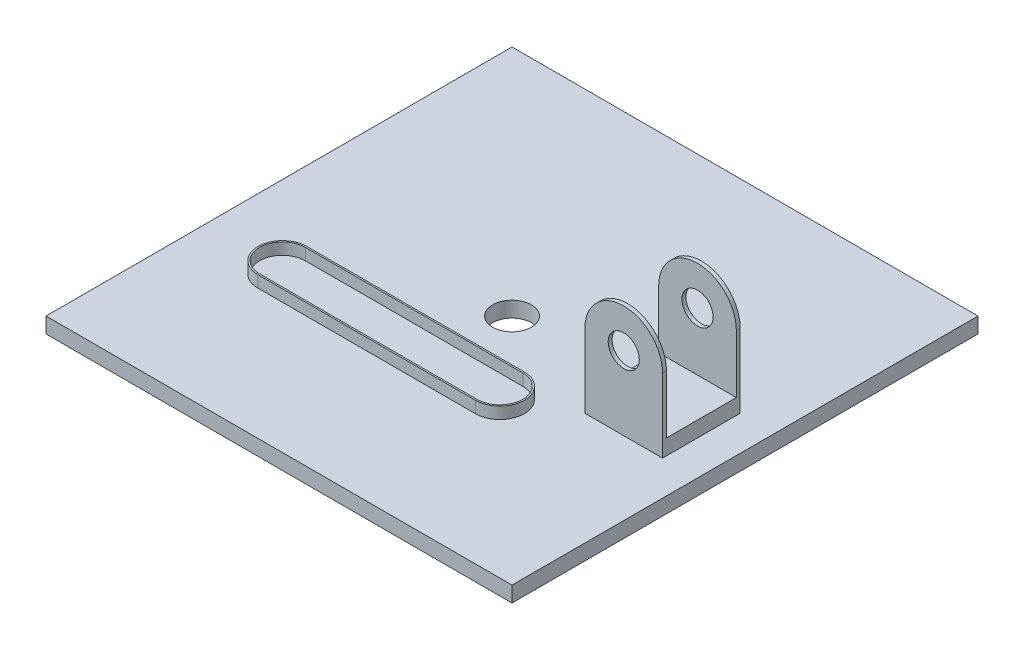
ISO-10303-21;
HEADER;
FILE_DESCRIPTION(('STEP AP214'),'2;1');
FILE_NAME('part.step','',(''),(''),'','','');
FILE_SCHEMA(('AUTOMOTIVE_DESIGN { 1 0 10303 214 1 1 1 1 }'));
ENDSEC;
DATA;
#1=APPLICATION_CONTEXT('core data for automotive mechanical design processes');
#2=APPLICATION_PROTOCOL_DEFINITION('international standard','automotive_design',2000,#1);
#3=PRODUCT_CONTEXT('',#1,'mechanical');
#4=PRODUCT('Part','Part','',(#3));
#5=PRODUCT_RELATED_PRODUCT_CATEGORY('part','',(#4));
#6=PRODUCT_DEFINITION_FORMATION('','',#4);
#7=PRODUCT_DEFINITION_CONTEXT('part definition',#1,'design');
#8=PRODUCT_DEFINITION('design','',#6,#7);
#9=PRODUCT_DEFINITION_SHAPE('','',#8);
#10=(LENGTH_UNIT() NAMED_UNIT(*) SI_UNIT(.MILLI.,.METRE.));
#11=(NAMED_UNIT(*) PLANE_ANGLE_UNIT() SI_UNIT($,.RADIAN.));
#12=(NAMED_UNIT(*) SI_UNIT($,.STERADIAN.) SOLID_ANGLE_UNIT());
#13=UNCERTAINTY_MEASURE_WITH_UNIT(LENGTH_MEASURE(1.E-05),#10,'distance_accuracy_value','');
#14=(GEOMETRIC_REPRESENTATION_CONTEXT(3) GLOBAL_UNCERTAINTY_ASSIGNED_CONTEXT((#13)) GLOBAL_UNIT_ASSIGNED_CONTEXT((#10,
#11,#12)) REPRESENTATION_CONTEXT('',''));
#15=CARTESIAN_POINT('',(0.,0.,0.));
#16=DIRECTION('',(0.,0.,1.));
#17=DIRECTION('',(1.,0.,0.));
#18=AXIS2_PLACEMENT_3D('',#15,#16,#17);
#19=CARTESIAN_POINT('',(0.,40.,0.));
#20=DIRECTION('',(0.,-1.,0.));
#21=DIRECTION('',(0.,0.,-1.));
#22=AXIS2_PLACEMENT_3D('',#19,#20,#21);
#23=PLANE('',#22);
#24=DIRECTION('',(1.,0.,0.));
#25=VECTOR('',#24,1.);
#26=CARTESIAN_POINT('',(0.,40.,-33.5314516707189));
#27=LINE('',#26,#25);
#28=CARTESIAN_POINT('',(155.348971612439,40.,-33.5314516707189));
#29=VERTEX_POINT('',#28);
#30=CARTESIAN_POINT('',(255.348971612439,40.,-33.5314516707189));
#31=VERTEX_POINT('',#30);
#32=EDGE_CURVE('E283',#29,#31,#27,.T.);
#33=ORIENTED_EDGE('',*,*,#32,.F.);
#34=DIRECTION('',(0.,0.,1.));
#35=VECTOR('',#34,1.);
#36=CARTESIAN_POINT('',(155.348971612439,40.,61.4685483292811));
#37=LINE('',#36,#35);
#38=CARTESIAN_POINT('',(155.348971612439,40.,56.4685483292811));
#39=VERTEX_POINT('',#38);
#40=EDGE_CURVE('E329',#29,#39,#37,.T.);
#41=ORIENTED_EDGE('',*,*,#40,.T.);
#42=DIRECTION('',(-1.,0.,0.));
#43=VECTOR('',#42,1.);
#44=CARTESIAN_POINT('',(0.,40.,56.4685483292811));
#45=LINE('',#44,#43);
#46=CARTESIAN_POINT('',(255.348971612439,40.,56.4685483292811));
#47=VERTEX_POINT('',#46);
#48=EDGE_CURVE('E310',#47,#39,#45,.T.);
#49=ORIENTED_EDGE('',*,*,#48,.F.);
#50=DIRECTION('',(0.,0.,-1.));
#51=VECTOR('',#50,1.);
#52=CARTESIAN_POINT('',(255.348971612439,40.,61.4685483292811));
#53=LINE('',#52,#51);
#54=EDGE_CURVE('E327',#47,#31,#53,.T.);
#55=ORIENTED_EDGE('',*,*,#54,.T.);
#56=EDGE_LOOP('',(#33,#41,#49,#55));
#57=FACE_BOUND('',#56,.T.);
#58=ADVANCED_FACE('F65',(#57),#23,.F.);
#59=CARTESIAN_POINT('',(0.,20.,0.));
#60=DIRECTION('',(0.,-1.,0.));
#61=DIRECTION('',(0.,0.,-1.));
#62=AXIS2_PLACEMENT_3D('',#59,#60,#61);
#63=PLANE('',#62);
#64=CARTESIAN_POINT('',(0.,20.,0.));
#65=DIRECTION('',(0.,1.,0.));
#66=DIRECTION('',(0.,0.,1.));
#67=AXIS2_PLACEMENT_3D('',#64,#65,#66);
#68=CIRCLE('',#67,25.);
#69=CARTESIAN_POINT('',(0.,20.,25.));
#70=VERTEX_POINT('',#69);
#71=EDGE_CURVE('E683',#70,#70,#68,.T.);
#72=ORIENTED_EDGE('',*,*,#71,.F.);
#73=EDGE_LOOP('',(#72));
#74=FACE_BOUND('',#73,.T.);
#75=DIRECTION('',(-1.,0.,0.));
#76=VECTOR('',#75,1.);
#77=CARTESIAN_POINT('',(0.,20.,69.4685483292811));
#78=LINE('',#77,#76);
#79=CARTESIAN_POINT('',(85.3547783407376,20.,69.4685483292811));
#80=VERTEX_POINT('',#79);
#81=CARTESIAN_POINT('',(-194.645221659262,20.,69.4685483292812));
#82=VERTEX_POINT('',#81);
#83=EDGE_CURVE('E220',#80,#82,#78,.T.);
#84=ORIENTED_EDGE('',*,*,#83,.F.);
#85=CARTESIAN_POINT('',(85.3547783407376,20.,100.968548329281));
#86=DIRECTION('',(0.,1.,0.));
#87=DIRECTION('',(1.,0.,0.));
#88=AXIS2_PLACEMENT_3D('',#85,#86,#87);
#89=CIRCLE('',#88,31.5);
#90=CARTESIAN_POINT('',(85.3547783407376,20.,132.468548329281));
#91=VERTEX_POINT('',#90);
#92=EDGE_CURVE('E249',#91,#80,#89,.T.);
#93=ORIENTED_EDGE('',*,*,#92,.F.);
#94=DIRECTION('',(-1.,0.,0.));
#95=VECTOR('',#94,1.);
#96=CARTESIAN_POINT('',(0.,20.,132.468548329281));
#97=LINE('',#96,#95);
#98=CARTESIAN_POINT('',(-194.645221659262,20.,132.468548329281));
#99=VERTEX_POINT('',#98);
#100=EDGE_CURVE('E85',#91,#99,#97,.T.);
#101=ORIENTED_EDGE('',*,*,#100,.T.);
#102=CARTESIAN_POINT('',(-194.645221659262,20.,100.968548329281));
#103=DIRECTION('',(0.,1.,0.));
#104=DIRECTION('',(1.,0.,0.));
#105=AXIS2_PLACEMENT_3D('',#102,#103,#104);
#106=CIRCLE('',#105,31.5);
#107=EDGE_CURVE('E80',#82,#99,#106,.T.);
#108=ORIENTED_EDGE('',*,*,#107,.F.);
#109=EDGE_LOOP('',(#84,#93,#101,#108));
#110=FACE_BOUND('',#109,.T.);
#111=DIRECTION('',(0.,0.,-1.));
#112=VECTOR('',#111,1.);
#113=CARTESIAN_POINT('',(300.,20.,300.));
#114=LINE('',#113,#112);
#115=CARTESIAN_POINT('',(300.,20.,300.));
#116=VERTEX_POINT('',#115);
#117=CARTESIAN_POINT('',(300.,20.,-300.));
#118=VERTEX_POINT('',#117);
#119=EDGE_CURVE('E355',#116,#118,#114,.T.);
#120=ORIENTED_EDGE('',*,*,#119,.T.);
#121=DIRECTION('',(-1.,0.,0.));
#122=VECTOR('',#121,1.);
#123=CARTESIAN_POINT('',(-300.,20.,-300.));
#124=LINE('',#123,#122);
#125=CARTESIAN_POINT('',(-300.,20.,-300.));
#126=VERTEX_POINT('',#125);
#127=EDGE_CURVE('E358',#118,#126,#124,.T.);
#128=ORIENTED_EDGE('',*,*,#127,.T.);
#129=DIRECTION('',(0.,0.,1.));
#130=VECTOR('',#129,1.);
#131=CARTESIAN_POINT('',(-300.,20.,300.));
#132=LINE('',#131,#130);
#133=CARTESIAN_POINT('',(-300.,20.,300.));
#134=VERTEX_POINT('',#133);
#135=EDGE_CURVE('E361',#126,#134,#132,.T.);
#136=ORIENTED_EDGE('',*,*,#135,.T.);
#137=DIRECTION('',(1.,0.,0.));
#138=VECTOR('',#137,1.);
#139=CARTESIAN_POINT('',(-300.,20.,300.));
#140=LINE('',#139,#138);
#141=EDGE_CURVE('E363',#134,#116,#140,.T.);
#142=ORIENTED_EDGE('',*,*,#141,.T.);
#143=EDGE_LOOP('',(#120,#128,#136,#142));
#144=FACE_BOUND('',#143,.T.);
#145=DIRECTION('',(0.,0.,-1.));
#146=VECTOR('',#145,1.);
#147=CARTESIAN_POINT('',(255.348971612439,20.,61.4685483292811));
#148=LINE('',#147,#146);
#149=CARTESIAN_POINT('',(255.348971612439,20.,61.4685483292811));
#150=VERTEX_POINT('',#149);
#151=CARTESIAN_POINT('',(255.348971612439,20.,-38.5314516707189));
#152=VERTEX_POINT('',#151);
#153=EDGE_CURVE('E324',#150,#152,#148,.T.);
#154=ORIENTED_EDGE('',*,*,#153,.F.);
#155=DIRECTION('',(1.,0.,0.));
#156=VECTOR('',#155,1.);
#157=CARTESIAN_POINT('',(155.348971612439,20.,61.4685483292811));
#158=LINE('',#157,#156);
#159=CARTESIAN_POINT('',(155.348971612439,20.,61.4685483292811));
#160=VERTEX_POINT('',#159);
#161=EDGE_CURVE('E330',#160,#150,#158,.T.);
#162=ORIENTED_EDGE('',*,*,#161,.F.);
#163=DIRECTION('',(0.,0.,1.));
#164=VECTOR('',#163,1.);
#165=CARTESIAN_POINT('',(155.348971612439,20.,61.4685483292811));
#166=LINE('',#165,#164);
#167=CARTESIAN_POINT('',(155.348971612439,20.,-38.5314516707189));
#168=VERTEX_POINT('',#167);
#169=EDGE_CURVE('E338',#168,#160,#166,.T.);
#170=ORIENTED_EDGE('',*,*,#169,.F.);
#171=DIRECTION('',(-1.,0.,0.));
#172=VECTOR('',#171,1.);
#173=CARTESIAN_POINT('',(155.348971612439,20.,-38.5314516707189));
#174=LINE('',#173,#172);
#175=EDGE_CURVE('E335',#152,#168,#174,.T.);
#176=ORIENTED_EDGE('',*,*,#175,.F.);
#177=EDGE_LOOP('',(#154,#162,#170,#176));
#178=FACE_BOUND('',#177,.T.);
#179=ADVANCED_FACE('F397',(#74,#110,#144,#178),#63,.F.);
#180=CARTESIAN_POINT('',(300.,20.,300.));
#181=DIRECTION('',(-1.,0.,0.));
#182=DIRECTION('',(0.,0.,1.));
#183=AXIS2_PLACEMENT_3D('',#180,#181,#182);
#184=PLANE('',#183);
#185=DIRECTION('',(0.,0.,-1.));
#186=VECTOR('',#185,1.);
#187=CARTESIAN_POINT('',(300.,0.,300.));
#188=LINE('',#187,#186);
#189=CARTESIAN_POINT('',(300.,0.,300.));
#190=VERTEX_POINT('',#189);
#191=CARTESIAN_POINT('',(300.,0.,-300.));
#192=VERTEX_POINT('',#191);
#193=EDGE_CURVE('E354',#190,#192,#188,.T.);
#194=ORIENTED_EDGE('',*,*,#193,.T.);
#195=DIRECTION('',(0.,-1.,0.));
#196=VECTOR('',#195,1.);
#197=CARTESIAN_POINT('',(300.,20.,-300.));
#198=LINE('',#197,#196);
#199=EDGE_CURVE('E12',#118,#192,#198,.T.);
#200=ORIENTED_EDGE('',*,*,#199,.F.);
#201=ORIENTED_EDGE('',*,*,#119,.F.);
#202=DIRECTION('',(0.,-1.,0.));
#203=VECTOR('',#202,1.);
#204=CARTESIAN_POINT('',(300.,20.,300.));
#205=LINE('',#204,#203);
#206=EDGE_CURVE('E365',#116,#190,#205,.T.);
#207=ORIENTED_EDGE('',*,*,#206,.T.);
#208=EDGE_LOOP('',(#194,#200,#201,#207));
#209=FACE_BOUND('',#208,.T.);
#210=ADVANCED_FACE('F67',(#209),#184,.F.);
#211=CARTESIAN_POINT('',(-300.,20.,-300.));
#212=DIRECTION('',(0.,0.,1.));
#213=DIRECTION('',(1.,0.,0.));
#214=AXIS2_PLACEMENT_3D('',#211,#212,#213);
#215=PLANE('',#214);
#216=DIRECTION('',(-1.,0.,0.));
#217=VECTOR('',#216,1.);
#218=CARTESIAN_POINT('',(-300.,0.,-300.));
#219=LINE('',#218,#217);
#220=CARTESIAN_POINT('',(-300.,0.,-300.));
#221=VERTEX_POINT('',#220);
#222=EDGE_CURVE('E368',#192,#221,#219,.T.);
#223=ORIENTED_EDGE('',*,*,#222,.T.);
#224=DIRECTION('',(0.,-1.,0.));
#225=VECTOR('',#224,1.);
#226=CARTESIAN_POINT('',(-300.,20.,-300.));
#227=LINE('',#226,#225);
#228=EDGE_CURVE('E73',#126,#221,#227,.T.);
#229=ORIENTED_EDGE('',*,*,#228,.F.);
#230=ORIENTED_EDGE('',*,*,#127,.F.);
#231=ORIENTED_EDGE('',*,*,#199,.T.);
#232=EDGE_LOOP('',(#223,#229,#230,#231));
#233=FACE_BOUND('',#232,.T.);
#234=ADVANCED_FACE('F399',(#233),#215,.F.);
#235=CARTESIAN_POINT('',(-300.,20.,300.));
#236=DIRECTION('',(1.,0.,0.));
#237=DIRECTION('',(0.,0.,-1.));
#238=AXIS2_PLACEMENT_3D('',#235,#236,#237);
#239=PLANE('',#238);
#240=DIRECTION('',(0.,0.,1.));
#241=VECTOR('',#240,1.);
#242=CARTESIAN_POINT('',(-300.,0.,300.));
#243=LINE('',#242,#241);
#244=CARTESIAN_POINT('',(-300.,0.,300.));
#245=VERTEX_POINT('',#244);
#246=EDGE_CURVE('E370',#221,#245,#243,.T.);
#247=ORIENTED_EDGE('',*,*,#246,.T.);
#248=DIRECTION('',(0.,-1.,0.));
#249=VECTOR('',#248,1.);
#250=CARTESIAN_POINT('',(-300.,20.,300.));
#251=LINE('',#250,#249);
#252=EDGE_CURVE('E375',#134,#245,#251,.T.);
#253=ORIENTED_EDGE('',*,*,#252,.F.);
#254=ORIENTED_EDGE('',*,*,#135,.F.);
#255=ORIENTED_EDGE('',*,*,#228,.T.);
#256=EDGE_LOOP('',(#247,#253,#254,#255));
#257=FACE_BOUND('',#256,.T.);
#258=ADVANCED_FACE('F382',(#257),#239,.F.);
#259=CARTESIAN_POINT('',(-300.,20.,300.));
#260=DIRECTION('',(0.,0.,-1.));
#261=DIRECTION('',(-1.,0.,0.));
#262=AXIS2_PLACEMENT_3D('',#259,#260,#261);
#263=PLANE('',#262);
#264=DIRECTION('',(1.,0.,0.));
#265=VECTOR('',#264,1.);
#266=CARTESIAN_POINT('',(-300.,0.,300.));
#267=LINE('',#266,#265);
#268=EDGE_CURVE('E359',#245,#190,#267,.T.);
#269=ORIENTED_EDGE('',*,*,#268,.T.);
#270=ORIENTED_EDGE('',*,*,#206,.F.);
#271=ORIENTED_EDGE('',*,*,#141,.F.);
#272=ORIENTED_EDGE('',*,*,#252,.T.);
#273=EDGE_LOOP('',(#269,#270,#271,#272));
#274=FACE_BOUND('',#273,.T.);
#275=ADVANCED_FACE('F391',(#274),#263,.F.);
#276=CARTESIAN_POINT('',(0.,0.,0.));
#277=DIRECTION('',(0.,-1.,0.));
#278=DIRECTION('',(0.,0.,-1.));
#279=AXIS2_PLACEMENT_3D('',#276,#277,#278);
#280=PLANE('',#279);
#281=CARTESIAN_POINT('',(0.,0.,0.));
#282=DIRECTION('',(0.,-1.,0.));
#283=DIRECTION('',(0.,0.,-1.));
#284=AXIS2_PLACEMENT_3D('',#281,#282,#283);
#285=CIRCLE('',#284,25.);
#286=CARTESIAN_POINT('',(0.,0.,-25.));
#287=VERTEX_POINT('',#286);
#288=EDGE_CURVE('E234',#287,#287,#285,.F.);
#289=ORIENTED_EDGE('',*,*,#288,.T.);
#290=EDGE_LOOP('',(#289));
#291=FACE_BOUND('',#290,.T.);
#292=ORIENTED_EDGE('',*,*,#193,.F.);
#293=ORIENTED_EDGE('',*,*,#268,.F.);
#294=ORIENTED_EDGE('',*,*,#246,.F.);
#295=ORIENTED_EDGE('',*,*,#222,.F.);
#296=EDGE_LOOP('',(#292,#293,#294,#295));
#297=FACE_BOUND('',#296,.T.);
#298=ADVANCED_FACE('F388',(#291,#297),#280,.T.);
#299=CARTESIAN_POINT('',(255.348971612439,40.,61.4685483292811));
#300=DIRECTION('',(-1.,0.,0.));
#301=DIRECTION('',(0.,0.,1.));
#302=AXIS2_PLACEMENT_3D('',#299,#300,#301);
#303=PLANE('',#302);
#304=ORIENTED_EDGE('',*,*,#153,.T.);
#305=DIRECTION('',(0.,-1.,0.));
#306=VECTOR('',#305,1.);
#307=CARTESIAN_POINT('',(255.348971612439,40.,-38.5314516707189));
#308=LINE('',#307,#306);
#309=CARTESIAN_POINT('',(255.348971612439,114.766543298254,-38.5314516707189));
#310=VERTEX_POINT('',#309);
#311=EDGE_CURVE('E351',#310,#152,#308,.T.);
#312=ORIENTED_EDGE('',*,*,#311,.F.);
#313=DIRECTION('',(0.,0.,-1.));
#314=VECTOR('',#313,1.);
#315=CARTESIAN_POINT('',(255.348971612439,114.766543298254,-33.5314516707189));
#316=LINE('',#315,#314);
#317=CARTESIAN_POINT('',(255.348971612439,114.766543298254,-33.5314516707189));
#318=VERTEX_POINT('',#317);
#319=EDGE_CURVE('E289',#318,#310,#316,.T.);
#320=ORIENTED_EDGE('',*,*,#319,.F.);
#321=DIRECTION('',(0.,-1.,0.));
#322=VECTOR('',#321,1.);
#323=CARTESIAN_POINT('',(255.348971612439,0.,-33.5314516707189));
#324=LINE('',#323,#322);
#325=EDGE_CURVE('E280',#318,#31,#324,.T.);
#326=ORIENTED_EDGE('',*,*,#325,.T.);
#327=ORIENTED_EDGE('',*,*,#54,.F.);
#328=DIRECTION('',(0.,-1.,0.));
#329=VECTOR('',#328,1.);
#330=CARTESIAN_POINT('',(255.348971612439,0.,56.4685483292811));
#331=LINE('',#330,#329);
#332=CARTESIAN_POINT('',(255.348971612439,114.766543298255,56.4685483292811));
#333=VERTEX_POINT('',#332);
#334=EDGE_CURVE('E313',#333,#47,#331,.T.);
#335=ORIENTED_EDGE('',*,*,#334,.F.);
#336=DIRECTION('',(0.,0.,1.));
#337=VECTOR('',#336,1.);
#338=CARTESIAN_POINT('',(255.348971612439,114.766543298255,56.4685483292811));
#339=LINE('',#338,#337);
#340=CARTESIAN_POINT('',(255.348971612439,114.766543298255,61.4685483292811));
#341=VERTEX_POINT('',#340);
#342=EDGE_CURVE('E321',#333,#341,#339,.T.);
#343=ORIENTED_EDGE('',*,*,#342,.T.);
#344=DIRECTION('',(0.,-1.,0.));
#345=VECTOR('',#344,1.);
#346=CARTESIAN_POINT('',(255.348971612439,40.,61.4685483292811));
#347=LINE('',#346,#345);
#348=EDGE_CURVE('E332',#341,#150,#347,.T.);
#349=ORIENTED_EDGE('',*,*,#348,.T.);
#350=EDGE_LOOP('',(#304,#312,#320,#326,#327,#335,#343,#349));
#351=FACE_BOUND('',#350,.T.);
#352=ADVANCED_FACE('F434',(#351),#303,.F.);
#353=CARTESIAN_POINT('',(155.348971612439,40.,-38.5314516707189));
#354=DIRECTION('',(0.,0.,1.));
#355=DIRECTION('',(1.,0.,0.));
#356=AXIS2_PLACEMENT_3D('',#353,#354,#355);
#357=PLANE('',#356);
#358=ORIENTED_EDGE('',*,*,#175,.T.);
#359=DIRECTION('',(0.,-1.,0.));
#360=VECTOR('',#359,1.);
#361=CARTESIAN_POINT('',(155.348971612439,40.,-38.5314516707189));
#362=LINE('',#361,#360);
#363=CARTESIAN_POINT('',(155.348971612439,114.766543298255,-38.5314516707189));
#364=VERTEX_POINT('',#363);
#365=EDGE_CURVE('E348',#364,#168,#362,.T.);
#366=ORIENTED_EDGE('',*,*,#365,.F.);
#367=CARTESIAN_POINT('',(205.348971612439,114.766543298255,-38.5314516707189));
#368=DIRECTION('',(0.,0.,-1.));
#369=DIRECTION('',(-1.,0.,0.));
#370=AXIS2_PLACEMENT_3D('',#367,#368,#369);
#371=CIRCLE('',#370,50.);
#372=EDGE_CURVE('E277',#310,#364,#371,.F.);
#373=ORIENTED_EDGE('',*,*,#372,.F.);
#374=ORIENTED_EDGE('',*,*,#311,.T.);
#375=EDGE_LOOP('',(#358,#366,#373,#374));
#376=FACE_BOUND('',#375,.T.);
#377=CARTESIAN_POINT('',(205.348971612439,114.766543298255,-38.5314516707189));
#378=DIRECTION('',(0.,0.,-1.));
#379=DIRECTION('',(-1.,0.,0.));
#380=AXIS2_PLACEMENT_3D('',#377,#378,#379);
#381=CIRCLE('',#380,20.);
#382=CARTESIAN_POINT('',(185.348971612439,114.766543298255,-38.5314516707189));
#383=VERTEX_POINT('',#382);
#384=EDGE_CURVE('E272',#383,#383,#381,.T.);
#385=ORIENTED_EDGE('',*,*,#384,.F.);
#386=EDGE_LOOP('',(#385));
#387=FACE_BOUND('',#386,.T.);
#388=ADVANCED_FACE('F430',(#376,#387),#357,.F.);
#389=CARTESIAN_POINT('',(155.348971612439,40.,61.4685483292811));
#390=DIRECTION('',(1.,0.,0.));
#391=DIRECTION('',(0.,0.,-1.));
#392=AXIS2_PLACEMENT_3D('',#389,#390,#391);
#393=PLANE('',#392);
#394=ORIENTED_EDGE('',*,*,#169,.T.);
#395=DIRECTION('',(0.,-1.,0.));
#396=VECTOR('',#395,1.);
#397=CARTESIAN_POINT('',(155.348971612439,40.,61.4685483292811));
#398=LINE('',#397,#396);
#399=CARTESIAN_POINT('',(155.348971612439,114.766543298255,61.4685483292811));
#400=VERTEX_POINT('',#399);
#401=EDGE_CURVE('E345',#400,#160,#398,.T.);
#402=ORIENTED_EDGE('',*,*,#401,.F.);
#403=DIRECTION('',(0.,0.,1.));
#404=VECTOR('',#403,1.);
#405=CARTESIAN_POINT('',(155.348971612439,114.766543298255,56.4685483292811));
#406=LINE('',#405,#404);
#407=CARTESIAN_POINT('',(155.348971612439,114.766543298255,56.4685483292811));
#408=VERTEX_POINT('',#407);
#409=EDGE_CURVE('E316',#408,#400,#406,.T.);
#410=ORIENTED_EDGE('',*,*,#409,.F.);
#411=DIRECTION('',(0.,-1.,0.));
#412=VECTOR('',#411,1.);
#413=CARTESIAN_POINT('',(155.348971612439,0.,56.4685483292811));
#414=LINE('',#413,#412);
#415=EDGE_CURVE('E307',#408,#39,#414,.T.);
#416=ORIENTED_EDGE('',*,*,#415,.T.);
#417=ORIENTED_EDGE('',*,*,#40,.F.);
#418=DIRECTION('',(0.,-1.,0.));
#419=VECTOR('',#418,1.);
#420=CARTESIAN_POINT('',(155.348971612439,0.,-33.5314516707189));
#421=LINE('',#420,#419);
#422=CARTESIAN_POINT('',(155.348971612439,114.766543298255,-33.5314516707189));
#423=VERTEX_POINT('',#422);
#424=EDGE_CURVE('E286',#423,#29,#421,.T.);
#425=ORIENTED_EDGE('',*,*,#424,.F.);
#426=DIRECTION('',(0.,0.,-1.));
#427=VECTOR('',#426,1.);
#428=CARTESIAN_POINT('',(155.348971612439,114.766543298255,-33.5314516707189));
#429=LINE('',#428,#427);
#430=EDGE_CURVE('E294',#423,#364,#429,.T.);
#431=ORIENTED_EDGE('',*,*,#430,.T.);
#432=ORIENTED_EDGE('',*,*,#365,.T.);
#433=EDGE_LOOP('',(#394,#402,#410,#416,#417,#425,#431,#432));
#434=FACE_BOUND('',#433,.T.);
#435=ADVANCED_FACE('F426',(#434),#393,.F.);
#436=CARTESIAN_POINT('',(155.348971612439,40.,61.4685483292811));
#437=DIRECTION('',(0.,0.,-1.));
#438=DIRECTION('',(-1.,0.,0.));
#439=AXIS2_PLACEMENT_3D('',#436,#437,#438);
#440=PLANE('',#439);
#441=ORIENTED_EDGE('',*,*,#161,.T.);
#442=ORIENTED_EDGE('',*,*,#348,.F.);
#443=CARTESIAN_POINT('',(205.348971612439,114.766543298255,61.4685483292811));
#444=DIRECTION('',(0.,0.,1.));
#445=DIRECTION('',(1.,0.,0.));
#446=AXIS2_PLACEMENT_3D('',#443,#444,#445);
#447=CIRCLE('',#446,50.);
#448=EDGE_CURVE('E304',#400,#341,#447,.F.);
#449=ORIENTED_EDGE('',*,*,#448,.F.);
#450=ORIENTED_EDGE('',*,*,#401,.T.);
#451=EDGE_LOOP('',(#441,#442,#449,#450));
#452=FACE_BOUND('',#451,.T.);
#453=CARTESIAN_POINT('',(205.348971612439,114.766543298255,61.4685483292811));
#454=DIRECTION('',(0.,0.,1.));
#455=DIRECTION('',(1.,0.,0.));
#456=AXIS2_PLACEMENT_3D('',#453,#454,#455);
#457=CIRCLE('',#456,20.);
#458=CARTESIAN_POINT('',(225.348971612439,114.766543298255,61.4685483292811));
#459=VERTEX_POINT('',#458);
#460=EDGE_CURVE('E297',#459,#459,#457,.T.);
#461=ORIENTED_EDGE('',*,*,#460,.F.);
#462=EDGE_LOOP('',(#461));
#463=FACE_BOUND('',#462,.T.);
#464=ADVANCED_FACE('F422',(#452,#463),#440,.F.);
#465=CARTESIAN_POINT('',(205.348971612439,114.766543298255,56.4685483292811));
#466=DIRECTION('',(0.,0.,1.));
#467=DIRECTION('',(1.,0.,0.));
#468=AXIS2_PLACEMENT_3D('',#465,#466,#467);
#469=CYLINDRICAL_SURFACE('',#468,50.);
#470=ORIENTED_EDGE('',*,*,#448,.T.);
#471=ORIENTED_EDGE('',*,*,#342,.F.);
#472=CARTESIAN_POINT('',(205.348971612439,114.766543298255,56.4685483292811));
#473=DIRECTION('',(0.,0.,1.));
#474=DIRECTION('',(1.,0.,0.));
#475=AXIS2_PLACEMENT_3D('',#472,#473,#474);
#476=CIRCLE('',#475,50.);
#477=EDGE_CURVE('E303',#408,#333,#476,.F.);
#478=ORIENTED_EDGE('',*,*,#477,.F.);
#479=ORIENTED_EDGE('',*,*,#409,.T.);
#480=EDGE_LOOP('',(#470,#471,#478,#479));
#481=FACE_BOUND('',#480,.T.);
#482=ADVANCED_FACE('F425',(#481),#469,.T.);
#483=CARTESIAN_POINT('',(205.348971612439,114.766543298255,56.4685483292811));
#484=DIRECTION('',(0.,0.,1.));
#485=DIRECTION('',(1.,0.,0.));
#486=AXIS2_PLACEMENT_3D('',#483,#484,#485);
#487=CYLINDRICAL_SURFACE('',#486,20.);
#488=CARTESIAN_POINT('',(205.348971612439,114.766543298255,56.4685483292811));
#489=DIRECTION('',(0.,0.,1.));
#490=DIRECTION('',(1.,0.,0.));
#491=AXIS2_PLACEMENT_3D('',#488,#489,#490);
#492=CIRCLE('',#491,20.);
#493=CARTESIAN_POINT('',(225.348971612439,114.766543298255,56.4685483292811));
#494=VERTEX_POINT('',#493);
#495=EDGE_CURVE('E300',#494,#494,#492,.T.);
#496=ORIENTED_EDGE('',*,*,#495,.F.);
#497=EDGE_LOOP('',(#496));
#498=FACE_BOUND('',#497,.T.);
#499=ORIENTED_EDGE('',*,*,#460,.T.);
#500=EDGE_LOOP('',(#499));
#501=FACE_BOUND('',#500,.T.);
#502=ADVANCED_FACE('F420',(#498,#501),#487,.F.);
#503=CARTESIAN_POINT('',(0.,0.,56.4685483292811));
#504=DIRECTION('',(0.,0.,1.));
#505=DIRECTION('',(1.,0.,0.));
#506=AXIS2_PLACEMENT_3D('',#503,#504,#505);
#507=PLANE('',#506);
#508=ORIENTED_EDGE('',*,*,#495,.T.);
#509=EDGE_LOOP('',(#508));
#510=FACE_BOUND('',#509,.T.);
#511=ORIENTED_EDGE('',*,*,#477,.T.);
#512=ORIENTED_EDGE('',*,*,#334,.T.);
#513=ORIENTED_EDGE('',*,*,#48,.T.);
#514=ORIENTED_EDGE('',*,*,#415,.F.);
#515=EDGE_LOOP('',(#511,#512,#513,#514));
#516=FACE_BOUND('',#515,.T.);
#517=ADVANCED_FACE('F466',(#510,#516),#507,.F.);
#518=CARTESIAN_POINT('',(205.348971612439,114.766543298255,-33.5314516707189));
#519=DIRECTION('',(0.,0.,-1.));
#520=DIRECTION('',(-1.,0.,0.));
#521=AXIS2_PLACEMENT_3D('',#518,#519,#520);
#522=CYLINDRICAL_SURFACE('',#521,50.);
#523=ORIENTED_EDGE('',*,*,#372,.T.);
#524=ORIENTED_EDGE('',*,*,#430,.F.);
#525=CARTESIAN_POINT('',(205.348971612439,114.766543298255,-33.5314516707189));
#526=DIRECTION('',(0.,0.,-1.));
#527=DIRECTION('',(-1.,0.,0.));
#528=AXIS2_PLACEMENT_3D('',#525,#526,#527);
#529=CIRCLE('',#528,50.);
#530=EDGE_CURVE('E276',#318,#423,#529,.F.);
#531=ORIENTED_EDGE('',*,*,#530,.F.);
#532=ORIENTED_EDGE('',*,*,#319,.T.);
#533=EDGE_LOOP('',(#523,#524,#531,#532));
#534=FACE_BOUND('',#533,.T.);
#535=ADVANCED_FACE('F473',(#534),#522,.T.);
#536=CARTESIAN_POINT('',(205.348971612439,114.766543298255,-33.5314516707189));
#537=DIRECTION('',(0.,0.,-1.));
#538=DIRECTION('',(-1.,0.,0.));
#539=AXIS2_PLACEMENT_3D('',#536,#537,#538);
#540=CYLINDRICAL_SURFACE('',#539,20.);
#541=CARTESIAN_POINT('',(205.348971612439,114.766543298255,-33.5314516707189));
#542=DIRECTION('',(0.,0.,-1.));
#543=DIRECTION('',(-1.,0.,0.));
#544=AXIS2_PLACEMENT_3D('',#541,#542,#543);
#545=CIRCLE('',#544,20.);
#546=CARTESIAN_POINT('',(185.348971612439,114.766543298255,-33.5314516707189));
#547=VERTEX_POINT('',#546);
#548=EDGE_CURVE('E273',#547,#547,#545,.T.);
#549=ORIENTED_EDGE('',*,*,#548,.F.);
#550=EDGE_LOOP('',(#549));
#551=FACE_BOUND('',#550,.T.);
#552=ORIENTED_EDGE('',*,*,#384,.T.);
#553=EDGE_LOOP('',(#552));
#554=FACE_BOUND('',#553,.T.);
#555=ADVANCED_FACE('F513',(#551,#554),#540,.F.);
#556=CARTESIAN_POINT('',(0.,0.,-33.5314516707189));
#557=DIRECTION('',(0.,0.,-1.));
#558=DIRECTION('',(-1.,0.,0.));
#559=AXIS2_PLACEMENT_3D('',#556,#557,#558);
#560=PLANE('',#559);
#561=ORIENTED_EDGE('',*,*,#548,.T.);
#562=EDGE_LOOP('',(#561));
#563=FACE_BOUND('',#562,.T.);
#564=ORIENTED_EDGE('',*,*,#530,.T.);
#565=ORIENTED_EDGE('',*,*,#424,.T.);
#566=ORIENTED_EDGE('',*,*,#32,.T.);
#567=ORIENTED_EDGE('',*,*,#325,.F.);
#568=EDGE_LOOP('',(#564,#565,#566,#567));
#569=FACE_BOUND('',#568,.T.);
#570=ADVANCED_FACE('F523',(#563,#569),#560,.F.);
#571=CARTESIAN_POINT('',(-194.645221659262,35.,100.968548329281));
#572=DIRECTION('',(0.,1.,0.));
#573=DIRECTION('',(0.,0.,1.));
#574=AXIS2_PLACEMENT_3D('',#571,#572,#573);
#575=PLANE('',#574);
#576=DIRECTION('',(-1.,0.,0.));
#577=VECTOR('',#576,1.);
#578=CARTESIAN_POINT('',(0.,35.,69.4685483292811));
#579=LINE('',#578,#577);
#580=CARTESIAN_POINT('',(85.3547783407376,35.,69.4685483292811));
#581=VERTEX_POINT('',#580);
#582=CARTESIAN_POINT('',(-194.645221659262,35.,69.4685483292812));
#583=VERTEX_POINT('',#582);
#584=EDGE_CURVE('E245',#581,#583,#579,.T.);
#585=ORIENTED_EDGE('',*,*,#584,.T.);
#586=CARTESIAN_POINT('',(-194.645221659262,35.,100.968548329281));
#587=DIRECTION('',(0.,1.,0.));
#588=DIRECTION('',(1.,0.,0.));
#589=AXIS2_PLACEMENT_3D('',#586,#587,#588);
#590=CIRCLE('',#589,31.5);
#591=CARTESIAN_POINT('',(-194.645221659262,35.,132.468548329281));
#592=VERTEX_POINT('',#591);
#593=EDGE_CURVE('E248',#583,#592,#590,.T.);
#594=ORIENTED_EDGE('',*,*,#593,.T.);
#595=DIRECTION('',(-1.,0.,0.));
#596=VECTOR('',#595,1.);
#597=CARTESIAN_POINT('',(0.,35.,132.468548329281));
#598=LINE('',#597,#596);
#599=CARTESIAN_POINT('',(85.3547783407376,35.,132.468548329281));
#600=VERTEX_POINT('',#599);
#601=EDGE_CURVE('E251',#600,#592,#598,.T.);
#602=ORIENTED_EDGE('',*,*,#601,.F.);
#603=CARTESIAN_POINT('',(85.3547783407376,35.,100.968548329281));
#604=DIRECTION('',(0.,1.,0.));
#605=DIRECTION('',(1.,0.,0.));
#606=AXIS2_PLACEMENT_3D('',#603,#604,#605);
#607=CIRCLE('',#606,31.5);
#608=EDGE_CURVE('E254',#600,#581,#607,.T.);
#609=ORIENTED_EDGE('',*,*,#608,.T.);
#610=EDGE_LOOP('',(#585,#594,#602,#609));
#611=FACE_BOUND('',#610,.T.);
#612=CARTESIAN_POINT('',(-194.645221659262,35.,100.968548329281));
#613=DIRECTION('',(0.,1.,0.));
#614=DIRECTION('',(0.,0.,1.));
#615=AXIS2_PLACEMENT_3D('',#612,#613,#614);
#616=CIRCLE('',#615,29.5);
#617=CARTESIAN_POINT('',(-194.645221659262,35.,71.4685483292812));
#618=VERTEX_POINT('',#617);
#619=CARTESIAN_POINT('',(-194.645221659262,35.,130.468548329281));
#620=VERTEX_POINT('',#619);
#621=EDGE_CURVE('E212',#618,#620,#616,.T.);
#622=ORIENTED_EDGE('',*,*,#621,.F.);
#623=DIRECTION('',(-1.,0.,0.));
#624=VECTOR('',#623,1.);
#625=CARTESIAN_POINT('',(0.,35.,71.4685483292811));
#626=LINE('',#625,#624);
#627=CARTESIAN_POINT('',(85.3547783407376,35.,71.4685483292811));
#628=VERTEX_POINT('',#627);
#629=EDGE_CURVE('E202',#628,#618,#626,.T.);
#630=ORIENTED_EDGE('',*,*,#629,.F.);
#631=CARTESIAN_POINT('',(85.3547783407376,35.,100.968548329281));
#632=DIRECTION('',(0.,1.,0.));
#633=DIRECTION('',(0.,0.,1.));
#634=AXIS2_PLACEMENT_3D('',#631,#632,#633);
#635=CIRCLE('',#634,29.5);
#636=CARTESIAN_POINT('',(85.3547783407376,35.,130.468548329281));
#637=VERTEX_POINT('',#636);
#638=EDGE_CURVE('E227',#637,#628,#635,.T.);
#639=ORIENTED_EDGE('',*,*,#638,.F.);
#640=DIRECTION('',(-1.,0.,0.));
#641=VECTOR('',#640,1.);
#642=CARTESIAN_POINT('',(0.,35.,130.468548329281));
#643=LINE('',#642,#641);
#644=EDGE_CURVE('E225',#637,#620,#643,.T.);
#645=ORIENTED_EDGE('',*,*,#644,.T.);
#646=EDGE_LOOP('',(#622,#630,#639,#645));
#647=FACE_BOUND('',#646,.T.);
#648=ADVANCED_FACE('F224',(#611,#647),#575,.T.);
#649=CARTESIAN_POINT('',(0.,35.,69.4685483292811));
#650=DIRECTION('',(0.,0.,1.));
#651=DIRECTION('',(1.,0.,0.));
#652=AXIS2_PLACEMENT_3D('',#649,#650,#651);
#653=PLANE('',#652);
#654=ORIENTED_EDGE('',*,*,#83,.T.);
#655=DIRECTION('',(0.,-1.,0.));
#656=VECTOR('',#655,1.);
#657=CARTESIAN_POINT('',(-194.645221659262,35.,69.4685483292812));
#658=LINE('',#657,#656);
#659=EDGE_CURVE('E270',#583,#82,#658,.T.);
#660=ORIENTED_EDGE('',*,*,#659,.F.);
#661=ORIENTED_EDGE('',*,*,#584,.F.);
#662=DIRECTION('',(0.,-1.,0.));
#663=VECTOR('',#662,1.);
#664=CARTESIAN_POINT('',(85.3547783407376,35.,69.4685483292811));
#665=LINE('',#664,#663);
#666=EDGE_CURVE('E256',#581,#80,#665,.T.);
#667=ORIENTED_EDGE('',*,*,#666,.T.);
#668=EDGE_LOOP('',(#654,#660,#661,#667));
#669=FACE_BOUND('',#668,.T.);
#670=ADVANCED_FACE('F553',(#669),#653,.F.);
#671=CARTESIAN_POINT('',(-194.645221659262,35.,100.968548329281));
#672=DIRECTION('',(0.,-1.,0.));
#673=DIRECTION('',(0.,0.,-1.));
#674=AXIS2_PLACEMENT_3D('',#671,#672,#673);
#675=CYLINDRICAL_SURFACE('',#674,31.5);
#676=ORIENTED_EDGE('',*,*,#107,.T.);
#677=DIRECTION('',(0.,-1.,0.));
#678=VECTOR('',#677,1.);
#679=CARTESIAN_POINT('',(-194.645221659262,35.,132.468548329281));
#680=LINE('',#679,#678);
#681=EDGE_CURVE('E268',#592,#99,#680,.T.);
#682=ORIENTED_EDGE('',*,*,#681,.F.);
#683=ORIENTED_EDGE('',*,*,#593,.F.);
#684=ORIENTED_EDGE('',*,*,#659,.T.);
#685=EDGE_LOOP('',(#676,#682,#683,#684));
#686=FACE_BOUND('',#685,.T.);
#687=ADVANCED_FACE('F563',(#686),#675,.T.);
#688=CARTESIAN_POINT('',(0.,35.,132.468548329281));
#689=DIRECTION('',(0.,0.,1.));
#690=DIRECTION('',(1.,0.,0.));
#691=AXIS2_PLACEMENT_3D('',#688,#689,#690);
#692=PLANE('',#691);
#693=ORIENTED_EDGE('',*,*,#100,.F.);
#694=DIRECTION('',(0.,-1.,0.));
#695=VECTOR('',#694,1.);
#696=CARTESIAN_POINT('',(85.3547783407376,35.,132.468548329281));
#697=LINE('',#696,#695);
#698=EDGE_CURVE('E265',#600,#91,#697,.T.);
#699=ORIENTED_EDGE('',*,*,#698,.F.);
#700=ORIENTED_EDGE('',*,*,#601,.T.);
#701=ORIENTED_EDGE('',*,*,#681,.T.);
#702=EDGE_LOOP('',(#693,#699,#700,#701));
#703=FACE_BOUND('',#702,.T.);
#704=ADVANCED_FACE('F573',(#703),#692,.T.);
#705=CARTESIAN_POINT('',(85.3547783407376,35.,100.968548329281));
#706=DIRECTION('',(0.,-1.,0.));
#707=DIRECTION('',(0.,0.,-1.));
#708=AXIS2_PLACEMENT_3D('',#705,#706,#707);
#709=CYLINDRICAL_SURFACE('',#708,31.5);
#710=ORIENTED_EDGE('',*,*,#92,.T.);
#711=ORIENTED_EDGE('',*,*,#666,.F.);
#712=ORIENTED_EDGE('',*,*,#608,.F.);
#713=ORIENTED_EDGE('',*,*,#698,.T.);
#714=EDGE_LOOP('',(#710,#711,#712,#713));
#715=FACE_BOUND('',#714,.T.);
#716=ADVANCED_FACE('F583',(#715),#709,.T.);
#717=CARTESIAN_POINT('',(0.,35.,71.4685483292811));
#718=DIRECTION('',(0.,0.,1.));
#719=DIRECTION('',(1.,0.,0.));
#720=AXIS2_PLACEMENT_3D('',#717,#718,#719);
#721=PLANE('',#720);
#722=DIRECTION('',(-1.,0.,0.));
#723=VECTOR('',#722,1.);
#724=CARTESIAN_POINT('',(0.,20.,71.4685483292811));
#725=LINE('',#724,#723);
#726=CARTESIAN_POINT('',(85.3547783407376,20.,71.4685483292811));
#727=VERTEX_POINT('',#726);
#728=CARTESIAN_POINT('',(-194.645221659262,20.,71.4685483292812));
#729=VERTEX_POINT('',#728);
#730=EDGE_CURVE('E232',#727,#729,#725,.T.);
#731=ORIENTED_EDGE('',*,*,#730,.F.);
#732=DIRECTION('',(0.,-1.,0.));
#733=VECTOR('',#732,1.);
#734=CARTESIAN_POINT('',(85.3547783407376,35.,71.4685483292811));
#735=LINE('',#734,#733);
#736=EDGE_CURVE('E208',#628,#727,#735,.T.);
#737=ORIENTED_EDGE('',*,*,#736,.F.);
#738=ORIENTED_EDGE('',*,*,#629,.T.);
#739=DIRECTION('',(0.,-1.,0.));
#740=VECTOR('',#739,1.);
#741=CARTESIAN_POINT('',(-194.645221659262,35.,71.4685483292812));
#742=LINE('',#741,#740);
#743=EDGE_CURVE('E206',#618,#729,#742,.T.);
#744=ORIENTED_EDGE('',*,*,#743,.T.);
#745=EDGE_LOOP('',(#731,#737,#738,#744));
#746=FACE_BOUND('',#745,.T.);
#747=ADVANCED_FACE('F205',(#746),#721,.T.);
#748=CARTESIAN_POINT('',(-194.645221659262,35.,100.968548329281));
#749=DIRECTION('',(0.,-1.,0.));
#750=DIRECTION('',(0.,0.,-1.));
#751=AXIS2_PLACEMENT_3D('',#748,#749,#750);
#752=CYLINDRICAL_SURFACE('',#751,29.5);
#753=CARTESIAN_POINT('',(-194.645221659262,20.,100.968548329281));
#754=DIRECTION('',(0.,1.,0.));
#755=DIRECTION('',(0.,0.,1.));
#756=AXIS2_PLACEMENT_3D('',#753,#754,#755);
#757=CIRCLE('',#756,29.5);
#758=CARTESIAN_POINT('',(-194.645221659262,20.,130.468548329281));
#759=VERTEX_POINT('',#758);
#760=EDGE_CURVE('E219',#729,#759,#757,.T.);
#761=ORIENTED_EDGE('',*,*,#760,.F.);
#762=ORIENTED_EDGE('',*,*,#743,.F.);
#763=ORIENTED_EDGE('',*,*,#621,.T.);
#764=DIRECTION('',(0.,-1.,0.));
#765=VECTOR('',#764,1.);
#766=CARTESIAN_POINT('',(-194.645221659262,35.,130.468548329281));
#767=LINE('',#766,#765);
#768=EDGE_CURVE('E221',#620,#759,#767,.T.);
#769=ORIENTED_EDGE('',*,*,#768,.T.);
#770=EDGE_LOOP('',(#761,#762,#763,#769));
#771=FACE_BOUND('',#770,.T.);
#772=ADVANCED_FACE('F216',(#771),#752,.F.);
#773=CARTESIAN_POINT('',(0.,35.,130.468548329281));
#774=DIRECTION('',(0.,0.,1.));
#775=DIRECTION('',(1.,0.,0.));
#776=AXIS2_PLACEMENT_3D('',#773,#774,#775);
#777=PLANE('',#776);
#778=DIRECTION('',(-1.,0.,0.));
#779=VECTOR('',#778,1.);
#780=CARTESIAN_POINT('',(0.,20.,130.468548329281));
#781=LINE('',#780,#779);
#782=CARTESIAN_POINT('',(85.3547783407376,20.,130.468548329281));
#783=VERTEX_POINT('',#782);
#784=EDGE_CURVE('E236',#783,#759,#781,.T.);
#785=ORIENTED_EDGE('',*,*,#784,.T.);
#786=ORIENTED_EDGE('',*,*,#768,.F.);
#787=ORIENTED_EDGE('',*,*,#644,.F.);
#788=DIRECTION('',(0.,-1.,0.));
#789=VECTOR('',#788,1.);
#790=CARTESIAN_POINT('',(85.3547783407376,35.,130.468548329281));
#791=LINE('',#790,#789);
#792=EDGE_CURVE('E242',#637,#783,#791,.T.);
#793=ORIENTED_EDGE('',*,*,#792,.T.);
#794=EDGE_LOOP('',(#785,#786,#787,#793));
#795=FACE_BOUND('',#794,.T.);
#796=ADVANCED_FACE('F610',(#795),#777,.F.);
#797=CARTESIAN_POINT('',(85.3547783407376,35.,100.968548329281));
#798=DIRECTION('',(0.,-1.,0.));
#799=DIRECTION('',(0.,0.,-1.));
#800=AXIS2_PLACEMENT_3D('',#797,#798,#799);
#801=CYLINDRICAL_SURFACE('',#800,29.5);
#802=CARTESIAN_POINT('',(85.3547783407376,20.,100.968548329281));
#803=DIRECTION('',(0.,1.,0.));
#804=DIRECTION('',(0.,0.,1.));
#805=AXIS2_PLACEMENT_3D('',#802,#803,#804);
#806=CIRCLE('',#805,29.5);
#807=EDGE_CURVE('E213',#783,#727,#806,.T.);
#808=ORIENTED_EDGE('',*,*,#807,.F.);
#809=ORIENTED_EDGE('',*,*,#792,.F.);
#810=ORIENTED_EDGE('',*,*,#638,.T.);
#811=ORIENTED_EDGE('',*,*,#736,.T.);
#812=EDGE_LOOP('',(#808,#809,#810,#811));
#813=FACE_BOUND('',#812,.T.);
#814=ADVANCED_FACE('F544',(#813),#801,.F.);
#815=ORIENTED_EDGE('',*,*,#807,.T.);
#816=ORIENTED_EDGE('',*,*,#730,.T.);
#817=ORIENTED_EDGE('',*,*,#760,.T.);
#818=ORIENTED_EDGE('',*,*,#784,.F.);
#819=EDGE_LOOP('',(#815,#816,#817,#818));
#820=FACE_BOUND('',#819,.T.);
#821=ADVANCED_FACE('F416',(#820),#63,.F.);
#822=CARTESIAN_POINT('',(0.,-70.7106781186548,0.));
#823=DIRECTION('',(0.,1.,0.));
#824=DIRECTION('',(0.,0.,1.));
#825=AXIS2_PLACEMENT_3D('',#822,#823,#824);
#826=CYLINDRICAL_SURFACE('',#825,25.);
#827=ORIENTED_EDGE('',*,*,#71,.T.);
#828=EDGE_LOOP('',(#827));
#829=FACE_BOUND('',#828,.T.);
#830=ORIENTED_EDGE('',*,*,#288,.F.);
#831=EDGE_LOOP('',(#830));
#832=FACE_BOUND('',#831,.T.);
#833=ADVANCED_FACE('F543',(#829,#832),#826,.F.);
#834=CLOSED_SHELL('',(#58,#179,#210,#234,#258,#275,#298,#352,#388,#435,#464,#482,#502,#517,#535,
#555,#570,#648,#670,#687,#704,#716,#747,#772,#796,#814,#821,#833));
#835=MANIFOLD_SOLID_BREP('B2',#834);
#836=ADVANCED_BREP_SHAPE_REPRESENTATION('',(#18,#835),#14);
#837=SHAPE_DEFINITION_REPRESENTATION(#9,#836);
ENDSEC;
END-ISO-10303-21;
